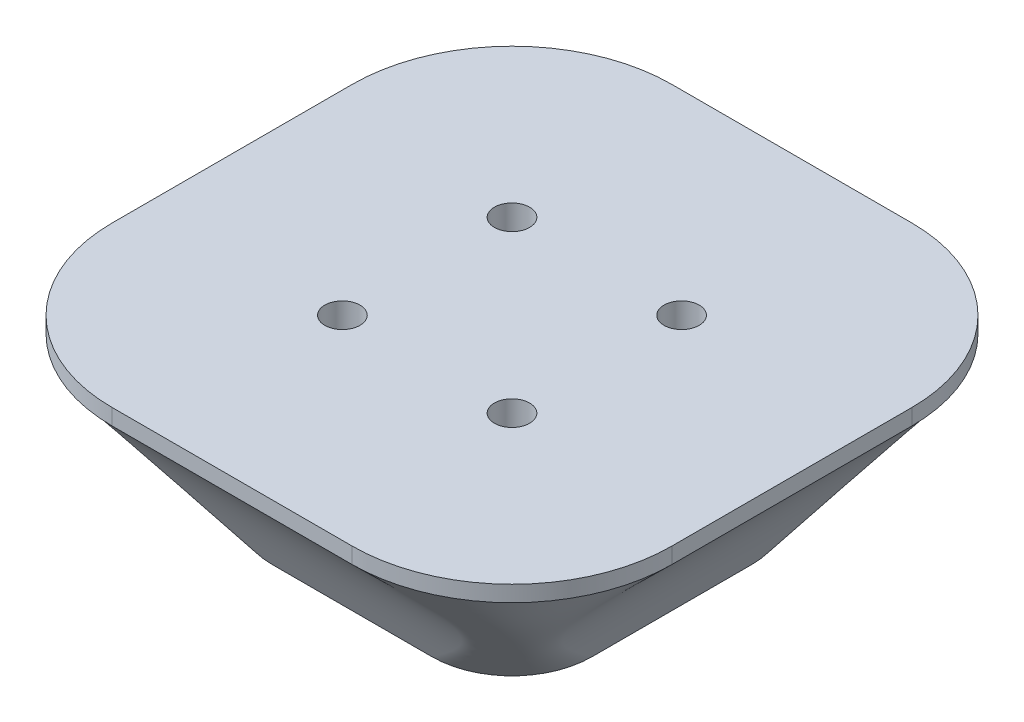
ISO-10303-21;
HEADER;
FILE_DESCRIPTION(('STEP AP214'),'2;1');
FILE_NAME('part.step','',(''),(''),'','','');
FILE_SCHEMA(('AUTOMOTIVE_DESIGN { 1 0 10303 214 1 1 1 1 }'));
ENDSEC;
DATA;
#1=APPLICATION_CONTEXT('core data for automotive mechanical design processes');
#2=APPLICATION_PROTOCOL_DEFINITION('international standard','automotive_design',2000,#1);
#3=PRODUCT_CONTEXT('',#1,'mechanical');
#4=PRODUCT('Part','Part','',(#3));
#5=PRODUCT_RELATED_PRODUCT_CATEGORY('part','',(#4));
#6=PRODUCT_DEFINITION_FORMATION('','',#4);
#7=PRODUCT_DEFINITION_CONTEXT('part definition',#1,'design');
#8=PRODUCT_DEFINITION('design','',#6,#7);
#9=PRODUCT_DEFINITION_SHAPE('','',#8);
#10=(LENGTH_UNIT() NAMED_UNIT(*) SI_UNIT(.MILLI.,.METRE.));
#11=(NAMED_UNIT(*) PLANE_ANGLE_UNIT() SI_UNIT($,.RADIAN.));
#12=(NAMED_UNIT(*) SI_UNIT($,.STERADIAN.) SOLID_ANGLE_UNIT());
#13=UNCERTAINTY_MEASURE_WITH_UNIT(LENGTH_MEASURE(1.E-05),#10,'distance_accuracy_value','');
#14=(GEOMETRIC_REPRESENTATION_CONTEXT(3) GLOBAL_UNCERTAINTY_ASSIGNED_CONTEXT((#13)) GLOBAL_UNIT_ASSIGNED_CONTEXT((#10,
#11,#12)) REPRESENTATION_CONTEXT('',''));
#15=CARTESIAN_POINT('',(0.,0.,0.));
#16=DIRECTION('',(0.,0.,1.));
#17=DIRECTION('',(1.,0.,0.));
#18=AXIS2_PLACEMENT_3D('',#15,#16,#17);
#19=CARTESIAN_POINT('',(-10.,0.,10.));
#20=DIRECTION('',(0.,-1.,0.));
#21=DIRECTION('',(0.,0.,-1.));
#22=AXIS2_PLACEMENT_3D('',#19,#20,#21);
#23=PLANE('',#22);
#24=CARTESIAN_POINT('',(-10.6066017177982,0.,10.6066017177982));
#25=DIRECTION('',(0.,-1.,0.));
#26=DIRECTION('',(0.,0.,-1.));
#27=AXIS2_PLACEMENT_3D('',#24,#25,#26);
#28=CIRCLE('',#27,2.2);
#29=CARTESIAN_POINT('',(-10.6066017177982,0.,8.40660171779821));
#30=VERTEX_POINT('',#29);
#31=EDGE_CURVE('E468',#30,#30,#28,.T.);
#32=ORIENTED_EDGE('',*,*,#31,.F.);
#33=EDGE_LOOP('',(#32));
#34=FACE_BOUND('',#33,.T.);
#35=CARTESIAN_POINT('',(10.6066017177982,0.,10.6066017177982));
#36=DIRECTION('',(0.,-1.,0.));
#37=DIRECTION('',(0.,0.,-1.));
#38=AXIS2_PLACEMENT_3D('',#35,#36,#37);
#39=CIRCLE('',#38,2.2);
#40=CARTESIAN_POINT('',(10.6066017177982,0.,8.40660171779821));
#41=VERTEX_POINT('',#40);
#42=EDGE_CURVE('E465',#41,#41,#39,.T.);
#43=ORIENTED_EDGE('',*,*,#42,.F.);
#44=EDGE_LOOP('',(#43));
#45=FACE_BOUND('',#44,.T.);
#46=CARTESIAN_POINT('',(10.6066017177982,0.,-10.6066017177982));
#47=DIRECTION('',(0.,-1.,0.));
#48=DIRECTION('',(0.,0.,-1.));
#49=AXIS2_PLACEMENT_3D('',#46,#47,#48);
#50=CIRCLE('',#49,2.2);
#51=CARTESIAN_POINT('',(10.6066017177982,0.,-12.8066017177982));
#52=VERTEX_POINT('',#51);
#53=EDGE_CURVE('E405',#52,#52,#50,.T.);
#54=ORIENTED_EDGE('',*,*,#53,.F.);
#55=EDGE_LOOP('',(#54));
#56=FACE_BOUND('',#55,.T.);
#57=CARTESIAN_POINT('',(-10.6066017177982,0.,-10.6066017177982));
#58=DIRECTION('',(0.,-1.,0.));
#59=DIRECTION('',(0.,0.,-1.));
#60=AXIS2_PLACEMENT_3D('',#57,#58,#59);
#61=CIRCLE('',#60,2.2);
#62=CARTESIAN_POINT('',(-10.6066017177982,0.,-12.8066017177982));
#63=VERTEX_POINT('',#62);
#64=EDGE_CURVE('E402',#63,#63,#61,.T.);
#65=ORIENTED_EDGE('',*,*,#64,.F.);
#66=EDGE_LOOP('',(#65));
#67=FACE_BOUND('',#66,.T.);
#68=CARTESIAN_POINT('',(-10.,0.,10.));
#69=DIRECTION('',(0.,-1.,0.));
#70=DIRECTION('',(0.,0.,-1.));
#71=AXIS2_PLACEMENT_3D('',#68,#69,#70);
#72=CIRCLE('',#71,10.);
#73=CARTESIAN_POINT('',(-9.99999999999993,0.,20.));
#74=VERTEX_POINT('',#73);
#75=CARTESIAN_POINT('',(-20.,0.,9.99999999982747));
#76=VERTEX_POINT('',#75);
#77=EDGE_CURVE('E471',#74,#76,#72,.T.);
#78=ORIENTED_EDGE('',*,*,#77,.T.);
#79=DIRECTION('',(0.,0.,-1.));
#80=VECTOR('',#79,1.);
#81=CARTESIAN_POINT('',(-20.,0.,9.99999999999993));
#82=LINE('',#81,#80);
#83=CARTESIAN_POINT('',(-20.,0.,-9.99999999962519));
#84=VERTEX_POINT('',#83);
#85=EDGE_CURVE('E307',#76,#84,#82,.T.);
#86=ORIENTED_EDGE('',*,*,#85,.T.);
#87=CARTESIAN_POINT('',(-10.,0.,-10.));
#88=DIRECTION('',(0.,-1.,0.));
#89=DIRECTION('',(0.,0.,-1.));
#90=AXIS2_PLACEMENT_3D('',#87,#88,#89);
#91=CIRCLE('',#90,10.);
#92=CARTESIAN_POINT('',(-9.99999999982747,0.,-20.));
#93=VERTEX_POINT('',#92);
#94=EDGE_CURVE('E571',#84,#93,#91,.T.);
#95=ORIENTED_EDGE('',*,*,#94,.T.);
#96=DIRECTION('',(1.,0.,0.));
#97=VECTOR('',#96,1.);
#98=CARTESIAN_POINT('',(-9.99999999999993,0.,-20.));
#99=LINE('',#98,#97);
#100=CARTESIAN_POINT('',(9.9999999996252,0.,-20.));
#101=VERTEX_POINT('',#100);
#102=EDGE_CURVE('E560',#93,#101,#99,.T.);
#103=ORIENTED_EDGE('',*,*,#102,.T.);
#104=CARTESIAN_POINT('',(10.,0.,-10.));
#105=DIRECTION('',(0.,1.,0.));
#106=DIRECTION('',(0.,0.,1.));
#107=AXIS2_PLACEMENT_3D('',#104,#105,#106);
#108=CIRCLE('',#107,10.);
#109=CARTESIAN_POINT('',(20.,0.,-9.99999999982735));
#110=VERTEX_POINT('',#109);
#111=EDGE_CURVE('E549',#110,#101,#108,.T.);
#112=ORIENTED_EDGE('',*,*,#111,.F.);
#113=DIRECTION('',(0.,0.,-1.));
#114=VECTOR('',#113,1.);
#115=CARTESIAN_POINT('',(20.,0.,9.99999999999993));
#116=LINE('',#115,#114);
#117=CARTESIAN_POINT('',(20.,0.,9.99999999970828));
#118=VERTEX_POINT('',#117);
#119=EDGE_CURVE('E538',#118,#110,#116,.T.);
#120=ORIENTED_EDGE('',*,*,#119,.F.);
#121=CARTESIAN_POINT('',(10.,0.,10.));
#122=DIRECTION('',(0.,1.,0.));
#123=DIRECTION('',(0.,0.,1.));
#124=AXIS2_PLACEMENT_3D('',#121,#122,#123);
#125=CIRCLE('',#124,10.);
#126=CARTESIAN_POINT('',(9.99999999999993,0.,20.));
#127=VERTEX_POINT('',#126);
#128=EDGE_CURVE('E527',#127,#118,#125,.T.);
#129=ORIENTED_EDGE('',*,*,#128,.F.);
#130=DIRECTION('',(1.,0.,0.));
#131=VECTOR('',#130,1.);
#132=CARTESIAN_POINT('',(-9.99999999999993,0.,20.));
#133=LINE('',#132,#131);
#134=EDGE_CURVE('E516',#74,#127,#133,.T.);
#135=ORIENTED_EDGE('',*,*,#134,.F.);
#136=EDGE_LOOP('',(#78,#86,#95,#103,#112,#120,#129,#135));
#137=FACE_BOUND('',#136,.T.);
#138=ADVANCED_FACE('F279',(#34,#45,#56,#67,#137),#23,.T.);
#139=CARTESIAN_POINT('',(9.99999999830563,0.,20.));
#140=CARTESIAN_POINT('',(16.1431482179764,5.21406175823628,22.942619762586));
#141=CARTESIAN_POINT('',(24.6079283399804,12.3986330477086,26.9973207696682));
#142=CARTESIAN_POINT('',(17.0679789418793,18.3639067395197,33.2775296026744));
#143=CARTESIAN_POINT('',(14.9999999970859,20.,35.));
#144=CARTESIAN_POINT('',(10.3058481270578,0.,20.));
#145=CARTESIAN_POINT('',(16.5111708958495,5.21406175823628,22.942619762586));
#146=CARTESIAN_POINT('',(25.0616227074619,12.3986330477086,26.9973207696682));
#147=CARTESIAN_POINT('',(17.5784503451764,18.3639067395197,33.2775296026744));
#148=CARTESIAN_POINT('',(15.5260436155817,20.,35.));
#149=CARTESIAN_POINT('',(10.925113102341,0.,19.9712504429643));
#150=CARTESIAN_POINT('',(17.1540095165254,5.21406175823627,22.8898791353974));
#151=CARTESIAN_POINT('',(25.7369439767388,12.3986330477086,26.9115223150476));
#152=CARTESIAN_POINT('',(18.5742471105834,18.3639067395198,33.2267115306444));
#153=CARTESIAN_POINT('',(16.6097370687949,20.,34.9587759836936));
#154=CARTESIAN_POINT('',(11.865329232195,0.,19.8389278624877));
#155=CARTESIAN_POINT('',(17.9597904094337,5.21406175823627,22.722646264018));
#156=CARTESIAN_POINT('',(26.3574835763062,12.3986330477086,26.6961857798917));
#157=CARTESIAN_POINT('',(20.05205466711,18.3639067395198,33.0154090244489));
#158=CARTESIAN_POINT('',(18.3226671694441,20.,34.7485798890286));
#159=CARTESIAN_POINT('',(12.8054765324051,0.,19.6144574632727));
#160=CARTESIAN_POINT('',(18.6454386943739,5.21406175823627,22.4956911128144));
#161=CARTESIAN_POINT('',(26.692452026007,12.3986330477086,26.4658068338374));
#162=CARTESIAN_POINT('',(21.5311474218129,18.3639067395197,32.665067050574));
#163=CARTESIAN_POINT('',(20.1155584456022,20.,34.3653357028723));
#164=CARTESIAN_POINT('',(14.0437311643957,0.,19.1883670742473));
#165=CARTESIAN_POINT('',(19.4333927586978,5.21406175823629,22.1386816547575));
#166=CARTESIAN_POINT('',(26.8599269552342,12.3986330477087,26.2039855220471));
#167=CARTESIAN_POINT('',(23.501266700484,18.3639067395197,32.000205315424));
#168=CARTESIAN_POINT('',(22.5800882783467,20.,33.5899322299198));
#169=CARTESIAN_POINT('',(15.5344398974085,0.,18.4106366720413));
#170=CARTESIAN_POINT('',(20.2205987417209,5.21406175823627,21.6246446707612));
#171=CARTESIAN_POINT('',(26.6777609027888,12.3986330477086,26.053297544936));
#172=CARTESIAN_POINT('',(25.9405677872702,18.3639067395198,30.7685151528263));
#173=CARTESIAN_POINT('',(25.7383781225062,20.,32.0617560246672));
#174=CARTESIAN_POINT('',(17.1204576713674,0.,17.1204576713674));
#175=CARTESIAN_POINT('',(20.9652110269836,5.21406175823629,20.9652110269836));
#176=CARTESIAN_POINT('',(26.2629819116934,12.3986330477087,26.2629819116934));
#177=CARTESIAN_POINT('',(28.6179123324305,18.3639067395197,28.6179123324305));
#178=CARTESIAN_POINT('',(29.2637981692459,20.,29.2637981692459));
#179=CARTESIAN_POINT('',(18.4106366720412,0.,15.5344398974084));
#180=CARTESIAN_POINT('',(21.6246446707612,5.21406175823628,20.2205987417209));
#181=CARTESIAN_POINT('',(26.0532975449361,12.3986330477086,26.6777609027887));
#182=CARTESIAN_POINT('',(30.7685151528262,18.3639067395197,25.9405677872702));
#183=CARTESIAN_POINT('',(32.0617560246671,20.,25.7383781225063));
#184=CARTESIAN_POINT('',(19.1883670742473,0.,14.0437311643958));
#185=CARTESIAN_POINT('',(22.1386816547575,5.21406175823627,19.4333927586978));
#186=CARTESIAN_POINT('',(26.2039855220471,12.3986330477086,26.8599269552342));
#187=CARTESIAN_POINT('',(32.000205315424,18.3639067395197,23.501266700484));
#188=CARTESIAN_POINT('',(33.5899322299199,20.,22.5800882783467));
#189=CARTESIAN_POINT('',(19.6144574632728,0.,12.8054765324051));
#190=CARTESIAN_POINT('',(22.4956911128144,5.21406175823629,18.6454386943739));
#191=CARTESIAN_POINT('',(26.4658068338375,12.3986330477087,26.692452026007));
#192=CARTESIAN_POINT('',(32.665067050574,18.3639067395198,21.5311474218129));
#193=CARTESIAN_POINT('',(34.3653357028723,20.,20.1155584456022));
#194=CARTESIAN_POINT('',(19.8389278624877,0.,11.865329232195));
#195=CARTESIAN_POINT('',(22.722646264018,5.21406175823625,17.9597904094336));
#196=CARTESIAN_POINT('',(26.6961857798917,12.3986330477086,26.3574835763062));
#197=CARTESIAN_POINT('',(33.0154090244489,18.3639067395197,20.05205466711));
#198=CARTESIAN_POINT('',(34.7485798890285,20.,18.3226671694441));
#199=CARTESIAN_POINT('',(19.9712504429643,0.,10.925113102341));
#200=CARTESIAN_POINT('',(22.8898791353974,5.2140617582363,17.1540095165254));
#201=CARTESIAN_POINT('',(26.9115223150476,12.3986330477087,25.7369439767388));
#202=CARTESIAN_POINT('',(33.2267115306444,18.3639067395198,18.5742471105834));
#203=CARTESIAN_POINT('',(34.9587759836935,20.,16.6097370687949));
#204=CARTESIAN_POINT('',(20.,0.,10.3058481270578));
#205=CARTESIAN_POINT('',(22.942619762586,5.21406175823628,16.5111708958495));
#206=CARTESIAN_POINT('',(26.9973207696682,12.3986330477086,25.0616227074618));
#207=CARTESIAN_POINT('',(33.2775296026744,18.3639067395197,17.5784503451764));
#208=CARTESIAN_POINT('',(35.,20.,15.5260436155817));
#209=CARTESIAN_POINT('',(20.,0.,8.24772891052919));
#210=CARTESIAN_POINT('',(22.942619762586,5.21406175823628,14.0346654859938));
#211=CARTESIAN_POINT('',(26.9973207696682,12.3986330477086,22.0086136864356));
#212=CARTESIAN_POINT('',(33.2775296026744,18.3639067395197,14.1433761830411));
#213=CARTESIAN_POINT('',(35.,20.,11.9861805980262));
#214=CARTESIAN_POINT('',(20.,0.,4.88085826567106));
#215=CARTESIAN_POINT('',(22.942619762586,5.21406175823629,9.11621031612582));
#216=CARTESIAN_POINT('',(26.9973207696682,12.3986330477087,14.9521958018056));
#217=CARTESIAN_POINT('',(33.2775296026744,18.3639067395197,8.65070804335033));
#218=CARTESIAN_POINT('',(35.,20.,6.92240148354227));
#219=CARTESIAN_POINT('',(20.,0.,0.));
#220=CARTESIAN_POINT('',(22.942619762586,5.21406175823628,0.));
#221=CARTESIAN_POINT('',(26.9973207696682,12.3986330477086,0.));
#222=CARTESIAN_POINT('',(33.2775296026744,18.3639067395197,0.));
#223=CARTESIAN_POINT('',(35.,20.,0.));
#224=CARTESIAN_POINT('',(20.,0.,-4.88085826567107));
#225=CARTESIAN_POINT('',(22.942619762586,5.21406175823627,-9.11621031612582));
#226=CARTESIAN_POINT('',(26.9973207696682,12.3986330477086,-14.9521958018056));
#227=CARTESIAN_POINT('',(33.2775296026744,18.3639067395197,-8.65070804335032));
#228=CARTESIAN_POINT('',(35.,20.,-6.92240148354226));
#229=CARTESIAN_POINT('',(20.,0.,-8.24772891052919));
#230=CARTESIAN_POINT('',(22.942619762586,5.21406175823628,-14.0346654859938));
#231=CARTESIAN_POINT('',(26.9973207696682,12.3986330477086,-22.0086136864356));
#232=CARTESIAN_POINT('',(33.2775296026744,18.3639067395197,-14.1433761830411));
#233=CARTESIAN_POINT('',(35.,20.,-11.9861805980262));
#234=CARTESIAN_POINT('',(20.,0.,-10.3058481270578));
#235=CARTESIAN_POINT('',(22.942619762586,5.21406175823628,-16.5111708958495));
#236=CARTESIAN_POINT('',(26.9973207696682,12.3986330477086,-25.0616227074619));
#237=CARTESIAN_POINT('',(33.2775296026744,18.3639067395197,-17.5784503451764));
#238=CARTESIAN_POINT('',(35.,20.,-15.5260436155816));
#239=CARTESIAN_POINT('',(19.9712504429642,0.,-10.925113102341));
#240=CARTESIAN_POINT('',(22.8898791353975,5.21406175823626,-17.1540095165254));
#241=CARTESIAN_POINT('',(26.9115223150476,12.3986330477086,-25.7369439767387));
#242=CARTESIAN_POINT('',(33.2267115306444,18.3639067395197,-18.5742471105834));
#243=CARTESIAN_POINT('',(34.9587759836936,20.,-16.6097370687949));
#244=CARTESIAN_POINT('',(19.8389278624877,0.,-11.865329232195));
#245=CARTESIAN_POINT('',(22.722646264018,5.21406175823628,-17.9597904094336));
#246=CARTESIAN_POINT('',(26.6961857798917,12.3986330477086,-26.3574835763062));
#247=CARTESIAN_POINT('',(33.0154090244489,18.3639067395198,-20.05205466711));
#248=CARTESIAN_POINT('',(34.7485798890286,20.,-18.3226671694441));
#249=CARTESIAN_POINT('',(19.6144574632727,0.,-12.8054765324051));
#250=CARTESIAN_POINT('',(22.4956911128144,5.21406175823627,-18.6454386943738));
#251=CARTESIAN_POINT('',(26.4658068338375,12.3986330477086,-26.6924520260069));
#252=CARTESIAN_POINT('',(32.665067050574,18.3639067395197,-21.5311474218129));
#253=CARTESIAN_POINT('',(34.3653357028723,20.,-20.1155584456022));
#254=CARTESIAN_POINT('',(19.1883670742473,0.,-14.0437311643957));
#255=CARTESIAN_POINT('',(22.1386816547574,5.21406175823629,-19.4333927586979));
#256=CARTESIAN_POINT('',(26.2039855220471,12.3986330477087,-26.8599269552343));
#257=CARTESIAN_POINT('',(32.000205315424,18.3639067395197,-23.501266700484));
#258=CARTESIAN_POINT('',(33.5899322299198,20.,-22.5800882783467));
#259=CARTESIAN_POINT('',(18.4106366720413,0.,-15.5344398974085));
#260=CARTESIAN_POINT('',(21.6246446707612,5.21406175823627,-20.2205987417209));
#261=CARTESIAN_POINT('',(26.053297544936,12.3986330477086,-26.6777609027887));
#262=CARTESIAN_POINT('',(30.7685151528264,18.3639067395198,-25.9405677872702));
#263=CARTESIAN_POINT('',(32.0617560246672,20.,-25.7383781225062));
#264=CARTESIAN_POINT('',(17.1204576713674,0.,-17.1204576713674));
#265=CARTESIAN_POINT('',(20.9652110269836,5.21406175823629,-20.9652110269836));
#266=CARTESIAN_POINT('',(26.2629819116934,12.3986330477087,-26.2629819116935));
#267=CARTESIAN_POINT('',(28.6179123324304,18.3639067395197,-28.6179123324305));
#268=CARTESIAN_POINT('',(29.2637981692458,20.,-29.2637981692459));
#269=CARTESIAN_POINT('',(15.5344398974085,0.,-18.4106366720413));
#270=CARTESIAN_POINT('',(20.220598741721,5.21406175823629,-21.6246446707612));
#271=CARTESIAN_POINT('',(26.6777609027889,12.3986330477087,-26.053297544936));
#272=CARTESIAN_POINT('',(25.9405677872702,18.3639067395198,-30.7685151528263));
#273=CARTESIAN_POINT('',(25.7383781225063,20.,-32.0617560246671));
#274=CARTESIAN_POINT('',(14.0437311643958,0.,-19.1883670742473));
#275=CARTESIAN_POINT('',(19.4333927586978,5.21406175823627,-22.1386816547575));
#276=CARTESIAN_POINT('',(26.8599269552341,12.3986330477086,-26.2039855220472));
#277=CARTESIAN_POINT('',(23.501266700484,18.3639067395197,-32.000205315424));
#278=CARTESIAN_POINT('',(22.5800882783467,20.,-33.5899322299199));
#279=CARTESIAN_POINT('',(12.8054765324051,0.,-19.6144574632727));
#280=CARTESIAN_POINT('',(18.6454386943739,5.21406175823629,-22.4956911128144));
#281=CARTESIAN_POINT('',(26.692452026007,12.3986330477087,-26.4658068338374));
#282=CARTESIAN_POINT('',(21.5311474218129,18.3639067395197,-32.665067050574));
#283=CARTESIAN_POINT('',(20.1155584456022,20.,-34.3653357028723));
#284=CARTESIAN_POINT('',(11.865329232195,0.,-19.8389278624877));
#285=CARTESIAN_POINT('',(17.9597904094336,5.21406175823627,-22.7226462640181));
#286=CARTESIAN_POINT('',(26.3574835763061,12.3986330477086,-26.6961857798919));
#287=CARTESIAN_POINT('',(20.05205466711,18.3639067395197,-33.0154090244489));
#288=CARTESIAN_POINT('',(18.3226671694441,20.,-34.7485798890285));
#289=CARTESIAN_POINT('',(10.925113102341,0.,-19.9712504429643));
#290=CARTESIAN_POINT('',(17.1540095165254,5.21406175823628,-22.8898791353974));
#291=CARTESIAN_POINT('',(25.7369439767388,12.3986330477086,-26.9115223150475));
#292=CARTESIAN_POINT('',(18.5742471105834,18.3639067395197,-33.2267115306443));
#293=CARTESIAN_POINT('',(16.6097370687949,20.,-34.9587759836935));
#294=CARTESIAN_POINT('',(10.3058481270578,0.,-20.));
#295=CARTESIAN_POINT('',(16.5111708958495,5.21406175823628,-22.942619762586));
#296=CARTESIAN_POINT('',(25.0616227074619,12.3986330477086,-26.9973207696682));
#297=CARTESIAN_POINT('',(17.5784503451764,18.3639067395197,-33.2775296026744));
#298=CARTESIAN_POINT('',(15.5260436155817,20.,-35.));
#299=CARTESIAN_POINT('',(8.24772891052919,0.,-20.));
#300=CARTESIAN_POINT('',(14.0346654859938,5.21406175823628,-22.942619762586));
#301=CARTESIAN_POINT('',(22.0086136864356,12.3986330477086,-26.9973207696682));
#302=CARTESIAN_POINT('',(14.1433761830411,18.3639067395197,-33.2775296026744));
#303=CARTESIAN_POINT('',(11.9861805980262,20.,-35.));
#304=CARTESIAN_POINT('',(4.88085826567106,0.,-20.));
#305=CARTESIAN_POINT('',(9.11621031612582,5.21406175823627,-22.942619762586));
#306=CARTESIAN_POINT('',(14.9521958018056,12.3986330477086,-26.9973207696682));
#307=CARTESIAN_POINT('',(8.65070804335032,18.3639067395197,-33.2775296026743));
#308=CARTESIAN_POINT('',(6.92240148354225,20.,-35.));
#309=CARTESIAN_POINT('',(0.,0.,-20.));
#310=CARTESIAN_POINT('',(0.,5.21406175823629,-22.942619762586));
#311=CARTESIAN_POINT('',(0.,12.3986330477087,-26.9973207696682));
#312=CARTESIAN_POINT('',(0.,18.3639067395197,-33.2775296026744));
#313=CARTESIAN_POINT('',(0.,20.,-35.));
#314=CARTESIAN_POINT('',(-4.88085826567107,0.,-20.));
#315=CARTESIAN_POINT('',(-9.11621031612582,5.21406175823628,-22.942619762586));
#316=CARTESIAN_POINT('',(-14.9521958018056,12.3986330477086,-26.9973207696682));
#317=CARTESIAN_POINT('',(-8.65070804335032,18.3639067395198,-33.2775296026744));
#318=CARTESIAN_POINT('',(-6.92240148354226,20.,-35.));
#319=CARTESIAN_POINT('',(-8.24772891052919,0.,-20.));
#320=CARTESIAN_POINT('',(-14.0346654859938,5.21406175823628,-22.942619762586));
#321=CARTESIAN_POINT('',(-22.0086136864356,12.3986330477086,-26.9973207696682));
#322=CARTESIAN_POINT('',(-14.1433761830411,18.3639067395197,-33.2775296026744));
#323=CARTESIAN_POINT('',(-11.9861805980262,20.,-35.));
#324=CARTESIAN_POINT('',(-10.3058481270579,0.,-20.));
#325=CARTESIAN_POINT('',(-16.5111708958495,5.21406175823628,-22.942619762586));
#326=CARTESIAN_POINT('',(-25.0616227074618,12.3986330477086,-26.9973207696682));
#327=CARTESIAN_POINT('',(-17.5784503451764,18.3639067395197,-33.2775296026744));
#328=CARTESIAN_POINT('',(-15.5260436155817,20.,-35.));
#329=CARTESIAN_POINT('',(-10.9251131023411,0.,-19.9712504429642));
#330=CARTESIAN_POINT('',(-17.1540095165255,5.21406175823627,-22.8898791353974));
#331=CARTESIAN_POINT('',(-25.7369439767387,12.3986330477086,-26.9115223150476));
#332=CARTESIAN_POINT('',(-18.5742471105834,18.3639067395197,-33.2267115306443));
#333=CARTESIAN_POINT('',(-16.6097370687949,20.,-34.9587759836935));
#334=CARTESIAN_POINT('',(-11.8653292321951,0.,-19.8389278624877));
#335=CARTESIAN_POINT('',(-17.9597904094337,5.21406175823628,-22.7226462640181));
#336=CARTESIAN_POINT('',(-26.3574835763062,12.3986330477086,-26.6961857798918));
#337=CARTESIAN_POINT('',(-20.05205466711,18.3639067395197,-33.0154090244489));
#338=CARTESIAN_POINT('',(-18.3226671694441,20.,-34.7485798890285));
#339=CARTESIAN_POINT('',(-12.8054765324052,0.,-19.6144574632727));
#340=CARTESIAN_POINT('',(-18.6454386943739,5.21406175823627,-22.4956911128144));
#341=CARTESIAN_POINT('',(-26.6924520260069,12.3986330477086,-26.4658068338374));
#342=CARTESIAN_POINT('',(-21.531147421813,18.3639067395197,-32.665067050574));
#343=CARTESIAN_POINT('',(-20.1155584456023,20.,-34.3653357028723));
#344=CARTESIAN_POINT('',(-14.0437311643958,0.,-19.1883670742473));
#345=CARTESIAN_POINT('',(-19.4333927586979,5.21406175823627,-22.1386816547574));
#346=CARTESIAN_POINT('',(-26.8599269552343,12.3986330477086,-26.2039855220471));
#347=CARTESIAN_POINT('',(-23.501266700484,18.3639067395197,-32.000205315424));
#348=CARTESIAN_POINT('',(-22.5800882783467,20.,-33.5899322299199));
#349=CARTESIAN_POINT('',(-15.5344398974085,0.,-18.4106366720412));
#350=CARTESIAN_POINT('',(-20.2205987417209,5.2140617582363,-21.6246446707612));
#351=CARTESIAN_POINT('',(-26.6777609027887,12.3986330477087,-26.0532975449361));
#352=CARTESIAN_POINT('',(-25.9405677872701,18.3639067395197,-30.7685151528263));
#353=CARTESIAN_POINT('',(-25.7383781225062,20.,-32.0617560246671));
#354=CARTESIAN_POINT('',(-17.1204576713674,0.,-17.1204576713674));
#355=CARTESIAN_POINT('',(-20.9652110269836,5.21406175823627,-20.9652110269836));
#356=CARTESIAN_POINT('',(-26.2629819116934,12.3986330477086,-26.2629819116933));
#357=CARTESIAN_POINT('',(-28.6179123324306,18.3639067395198,-28.6179123324305));
#358=CARTESIAN_POINT('',(-29.263798169246,20.0000000000001,-29.2637981692459));
#359=CARTESIAN_POINT('',(-18.4106366720412,0.,-15.5344398974084));
#360=CARTESIAN_POINT('',(-21.6246446707612,5.21406175823629,-20.2205987417209));
#361=CARTESIAN_POINT('',(-26.053297544936,12.3986330477087,-26.6777609027888));
#362=CARTESIAN_POINT('',(-30.7685151528262,18.3639067395197,-25.9405677872702));
#363=CARTESIAN_POINT('',(-32.061756024667,19.9999999999999,-25.7383781225062));
#364=CARTESIAN_POINT('',(-19.1883670742473,0.,-14.0437311643957));
#365=CARTESIAN_POINT('',(-22.1386816547575,5.21406175823627,-19.4333927586978));
#366=CARTESIAN_POINT('',(-26.2039855220472,12.3986330477086,-26.8599269552342));
#367=CARTESIAN_POINT('',(-32.0002053154241,18.3639067395198,-23.501266700484));
#368=CARTESIAN_POINT('',(-33.58993222992,20.,-22.5800882783467));
#369=CARTESIAN_POINT('',(-19.6144574632728,0.,-12.8054765324051));
#370=CARTESIAN_POINT('',(-22.4956911128144,5.21406175823628,-18.6454386943739));
#371=CARTESIAN_POINT('',(-26.4658068338373,12.3986330477086,-26.692452026007));
#372=CARTESIAN_POINT('',(-32.665067050574,18.3639067395198,-21.5311474218129));
#373=CARTESIAN_POINT('',(-34.3653357028723,20.,-20.1155584456022));
#374=CARTESIAN_POINT('',(-19.8389278624877,0.,-11.865329232195));
#375=CARTESIAN_POINT('',(-22.7226462640181,5.21406175823629,-17.9597904094336));
#376=CARTESIAN_POINT('',(-26.6961857798919,12.3986330477087,-26.3574835763062));
#377=CARTESIAN_POINT('',(-33.0154090244489,18.3639067395197,-20.05205466711));
#378=CARTESIAN_POINT('',(-34.7485798890285,20.,-18.3226671694441));
#379=CARTESIAN_POINT('',(-19.9712504429643,0.,-10.925113102341));
#380=CARTESIAN_POINT('',(-22.8898791353974,5.21406175823628,-17.1540095165254));
#381=CARTESIAN_POINT('',(-26.9115223150475,12.3986330477087,-25.7369439767387));
#382=CARTESIAN_POINT('',(-33.2267115306443,18.3639067395197,-18.5742471105834));
#383=CARTESIAN_POINT('',(-34.9587759836935,20.,-16.6097370687949));
#384=CARTESIAN_POINT('',(-20.,0.,-10.3058481270578));
#385=CARTESIAN_POINT('',(-22.942619762586,5.21406175823628,-16.5111708958495));
#386=CARTESIAN_POINT('',(-26.9973207696682,12.3986330477086,-25.0616227074618));
#387=CARTESIAN_POINT('',(-33.2775296026744,18.3639067395197,-17.5784503451764));
#388=CARTESIAN_POINT('',(-35.,20.,-15.5260436155816));
#389=CARTESIAN_POINT('',(-20.,0.,-8.24772891052919));
#390=CARTESIAN_POINT('',(-22.942619762586,5.21406175823628,-14.0346654859938));
#391=CARTESIAN_POINT('',(-26.9973207696682,12.3986330477086,-22.0086136864356));
#392=CARTESIAN_POINT('',(-33.2775296026744,18.3639067395197,-14.1433761830411));
#393=CARTESIAN_POINT('',(-35.,20.,-11.9861805980262));
#394=CARTESIAN_POINT('',(-20.,0.,-4.88085826567106));
#395=CARTESIAN_POINT('',(-22.942619762586,5.21406175823627,-9.11621031612581));
#396=CARTESIAN_POINT('',(-26.9973207696682,12.3986330477086,-14.9521958018056));
#397=CARTESIAN_POINT('',(-33.2775296026744,18.3639067395198,-8.65070804335031));
#398=CARTESIAN_POINT('',(-35.,20.,-6.92240148354225));
#399=CARTESIAN_POINT('',(-20.,0.,0.));
#400=CARTESIAN_POINT('',(-22.942619762586,5.2140617582363,0.));
#401=CARTESIAN_POINT('',(-26.9973207696682,12.3986330477087,0.));
#402=CARTESIAN_POINT('',(-33.2775296026744,18.3639067395197,0.));
#403=CARTESIAN_POINT('',(-35.,20.,0.));
#404=CARTESIAN_POINT('',(-20.,0.,4.88085826567107));
#405=CARTESIAN_POINT('',(-22.942619762586,5.21406175823627,9.11621031612584));
#406=CARTESIAN_POINT('',(-26.9973207696682,12.3986330477086,14.9521958018057));
#407=CARTESIAN_POINT('',(-33.2775296026744,18.3639067395198,8.65070804335036));
#408=CARTESIAN_POINT('',(-35.,20.,6.92240148354229));
#409=CARTESIAN_POINT('',(-20.,0.,8.24772891052919));
#410=CARTESIAN_POINT('',(-22.942619762586,5.21406175823628,14.0346654859938));
#411=CARTESIAN_POINT('',(-26.9973207696682,12.3986330477086,22.0086136864356));
#412=CARTESIAN_POINT('',(-33.2775296026744,18.3639067395197,14.1433761830411));
#413=CARTESIAN_POINT('',(-35.,20.,11.9861805980262));
#414=CARTESIAN_POINT('',(-20.,0.,10.3058481270578));
#415=CARTESIAN_POINT('',(-22.942619762586,5.21406175823628,16.5111708958495));
#416=CARTESIAN_POINT('',(-26.9973207696682,12.3986330477086,25.0616227074618));
#417=CARTESIAN_POINT('',(-33.2775296026744,18.3639067395197,17.5784503451764));
#418=CARTESIAN_POINT('',(-35.,20.,15.5260436155817));
#419=CARTESIAN_POINT('',(-19.9712504429642,0.,10.925113102341));
#420=CARTESIAN_POINT('',(-22.8898791353974,5.21406175823629,17.1540095165254));
#421=CARTESIAN_POINT('',(-26.9115223150476,12.3986330477087,25.7369439767388));
#422=CARTESIAN_POINT('',(-33.2267115306444,18.3639067395198,18.5742471105834));
#423=CARTESIAN_POINT('',(-34.9587759836935,20.,16.6097370687949));
#424=CARTESIAN_POINT('',(-19.8389278624877,0.,11.865329232195));
#425=CARTESIAN_POINT('',(-22.722646264018,5.21406175823626,17.9597904094336));
#426=CARTESIAN_POINT('',(-26.6961857798917,12.3986330477086,26.3574835763062));
#427=CARTESIAN_POINT('',(-33.0154090244489,18.3639067395197,20.05205466711));
#428=CARTESIAN_POINT('',(-34.7485798890285,20.,18.3226671694441));
#429=CARTESIAN_POINT('',(-19.6144574632727,0.,12.8054765324051));
#430=CARTESIAN_POINT('',(-22.4956911128144,5.21406175823626,18.6454386943738));
#431=CARTESIAN_POINT('',(-26.4658068338374,12.3986330477086,26.6924520260069));
#432=CARTESIAN_POINT('',(-32.665067050574,18.3639067395197,21.5311474218129));
#433=CARTESIAN_POINT('',(-34.3653357028723,20.,20.1155584456023));
#434=CARTESIAN_POINT('',(-19.1883670742473,0.,14.0437311643957));
#435=CARTESIAN_POINT('',(-22.1386816547575,5.21406175823633,19.4333927586979));
#436=CARTESIAN_POINT('',(-26.2039855220471,12.3986330477088,26.8599269552343));
#437=CARTESIAN_POINT('',(-32.000205315424,18.3639067395198,23.5012667004841));
#438=CARTESIAN_POINT('',(-33.5899322299199,20.,22.5800882783467));
#439=CARTESIAN_POINT('',(-18.4106366720412,0.,15.5344398974085));
#440=CARTESIAN_POINT('',(-21.6246446707612,5.21406175823623,20.2205987417208));
#441=CARTESIAN_POINT('',(-26.053297544936,12.3986330477085,26.6777609027886));
#442=CARTESIAN_POINT('',(-30.7685151528263,18.3639067395197,25.9405677872701));
#443=CARTESIAN_POINT('',(-32.0617560246672,20.,25.7383781225062));
#444=CARTESIAN_POINT('',(-17.1204576713674,0.,17.1204576713674));
#445=CARTESIAN_POINT('',(-20.9652110269836,5.21406175823634,20.9652110269837));
#446=CARTESIAN_POINT('',(-26.2629819116934,12.3986330477088,26.2629819116935));
#447=CARTESIAN_POINT('',(-28.6179123324305,18.3639067395198,28.6179123324306));
#448=CARTESIAN_POINT('',(-29.2637981692459,20.,29.2637981692459));
#449=CARTESIAN_POINT('',(-15.5344398974085,0.,18.4106366720413));
#450=CARTESIAN_POINT('',(-20.2205987417209,5.21406175823623,21.6246446707612));
#451=CARTESIAN_POINT('',(-26.6777609027886,12.3986330477085,26.053297544936));
#452=CARTESIAN_POINT('',(-25.9405677872702,18.3639067395197,30.7685151528262));
#453=CARTESIAN_POINT('',(-25.7383781225062,20.,32.0617560246671));
#454=CARTESIAN_POINT('',(-14.0437311643957,0.,19.1883670742473));
#455=CARTESIAN_POINT('',(-19.4333927586978,5.21406175823632,22.1386816547575));
#456=CARTESIAN_POINT('',(-26.8599269552342,12.3986330477087,26.2039855220472));
#457=CARTESIAN_POINT('',(-23.501266700484,18.3639067395198,32.0002053154241));
#458=CARTESIAN_POINT('',(-22.5800882783467,20.,33.58993222992));
#459=CARTESIAN_POINT('',(-12.8054765324051,0.,19.6144574632727));
#460=CARTESIAN_POINT('',(-18.6454386943738,5.21406175823627,22.4956911128144));
#461=CARTESIAN_POINT('',(-26.6924520260069,12.3986330477086,26.4658068338373));
#462=CARTESIAN_POINT('',(-21.5311474218129,18.3639067395197,32.665067050574));
#463=CARTESIAN_POINT('',(-20.1155584456022,20.,34.3653357028723));
#464=CARTESIAN_POINT('',(-11.865329232195,0.,19.8389278624877));
#465=CARTESIAN_POINT('',(-17.9597904094336,5.21406175823628,22.7226462640181));
#466=CARTESIAN_POINT('',(-26.3574835763062,12.3986330477086,26.6961857798919));
#467=CARTESIAN_POINT('',(-20.05205466711,18.3639067395198,33.0154090244489));
#468=CARTESIAN_POINT('',(-18.3226671694441,20.,34.7485798890285));
#469=CARTESIAN_POINT('',(-10.925113102341,0.,19.9712504429643));
#470=CARTESIAN_POINT('',(-17.1540095165254,5.21406175823627,22.8898791353974));
#471=CARTESIAN_POINT('',(-25.7369439767387,12.3986330477086,26.9115223150476));
#472=CARTESIAN_POINT('',(-18.5742471105834,18.3639067395197,33.2267115306443));
#473=CARTESIAN_POINT('',(-16.6097370687949,20.,34.9587759836935));
#474=CARTESIAN_POINT('',(-10.3058481270578,0.,20.));
#475=CARTESIAN_POINT('',(-16.5111708958495,5.21406175823628,22.942619762586));
#476=CARTESIAN_POINT('',(-25.0616227074618,12.3986330477086,26.9973207696682));
#477=CARTESIAN_POINT('',(-17.5784503451764,18.3639067395197,33.2775296026744));
#478=CARTESIAN_POINT('',(-15.5260436155817,20.,35.));
#479=CARTESIAN_POINT('',(-8.24772891052919,0.,20.));
#480=CARTESIAN_POINT('',(-14.0346654859938,5.21406175823628,22.942619762586));
#481=CARTESIAN_POINT('',(-22.0086136864356,12.3986330477086,26.9973207696682));
#482=CARTESIAN_POINT('',(-14.1433761830411,18.3639067395197,33.2775296026744));
#483=CARTESIAN_POINT('',(-11.9861805980262,20.,35.));
#484=CARTESIAN_POINT('',(-4.88085826567106,0.,20.));
#485=CARTESIAN_POINT('',(-9.11621031612581,5.21406175823627,22.942619762586));
#486=CARTESIAN_POINT('',(-14.9521958018056,12.3986330477086,26.9973207696682));
#487=CARTESIAN_POINT('',(-8.65070804335033,18.3639067395198,33.2775296026744));
#488=CARTESIAN_POINT('',(-6.92240148354227,20.,35.));
#489=CARTESIAN_POINT('',(0.,0.,20.));
#490=CARTESIAN_POINT('',(0.,5.21406175823628,22.942619762586));
#491=CARTESIAN_POINT('',(0.,12.3986330477086,26.9973207696681));
#492=CARTESIAN_POINT('',(0.,18.3639067395197,33.2775296026744));
#493=CARTESIAN_POINT('',(0.,20.,35.));
#494=CARTESIAN_POINT('',(4.88085826567107,0.,20.));
#495=CARTESIAN_POINT('',(9.11621031612582,5.21406175823628,22.942619762586));
#496=CARTESIAN_POINT('',(14.9521958018057,12.3986330477087,26.9973207696682));
#497=CARTESIAN_POINT('',(8.65070804335032,18.3639067395197,33.2775296026744));
#498=CARTESIAN_POINT('',(6.92240148354225,20.,35.));
#499=CARTESIAN_POINT('',(8.24772891052919,0.,20.));
#500=CARTESIAN_POINT('',(14.0346654859938,5.21406175823628,22.942619762586));
#501=CARTESIAN_POINT('',(22.0086136864356,12.3986330477086,26.9973207696682));
#502=CARTESIAN_POINT('',(14.1433761830411,18.3639067395197,33.2775296026744));
#503=CARTESIAN_POINT('',(11.9861805980262,20.,35.));
#504=CARTESIAN_POINT('',(9.99999999830563,0.,20.));
#505=CARTESIAN_POINT('',(16.1431482179764,5.21406175823628,22.942619762586));
#506=CARTESIAN_POINT('',(24.6079283399804,12.3986330477086,26.9973207696682));
#507=CARTESIAN_POINT('',(17.0679789418793,18.3639067395197,33.2775296026744));
#508=CARTESIAN_POINT('',(14.9999999970859,20.,35.));
#509=B_SPLINE_SURFACE_WITH_KNOTS('',3,3,((#139,#140,#141,#142,#143),(#144,#145,#146,#147,#148),
(#149,#150,#151,#152,#153),(#154,#155,#156,#157,#158),(#159,#160,#161,#162,#163),(#164,#165,
#166,#167,#168),(#169,#170,#171,#172,#173),(#174,#175,#176,#177,#178),(#179,#180,#181,#182,
#183),(#184,#185,#186,#187,#188),(#189,#190,#191,#192,#193),(#194,#195,#196,#197,#198),(#199,
#200,#201,#202,#203),(#204,#205,#206,#207,#208),(#209,#210,#211,#212,#213),(#214,#215,#216,#217,
#218),(#219,#220,#221,#222,#223),(#224,#225,#226,#227,#228),(#229,#230,#231,#232,#233),(#234,
#235,#236,#237,#238),(#239,#240,#241,#242,#243),(#244,#245,#246,#247,#248),(#249,#250,#251,#252,
#253),(#254,#255,#256,#257,#258),(#259,#260,#261,#262,#263),(#264,#265,#266,#267,#268),(#269,
#270,#271,#272,#273),(#274,#275,#276,#277,#278),(#279,#280,#281,#282,#283),(#284,#285,#286,#287,
#288),(#289,#290,#291,#292,#293),(#294,#295,#296,#297,#298),(#299,#300,#301,#302,#303),(#304,
#305,#306,#307,#308),(#309,#310,#311,#312,#313),(#314,#315,#316,#317,#318),(#319,#320,#321,#322,
#323),(#324,#325,#326,#327,#328),(#329,#330,#331,#332,#333),(#334,#335,#336,#337,#338),(#339,
#340,#341,#342,#343),(#344,#345,#346,#347,#348),(#349,#350,#351,#352,#353),(#354,#355,#356,#357,
#358),(#359,#360,#361,#362,#363),(#364,#365,#366,#367,#368),(#369,#370,#371,#372,#373),(#374,
#375,#376,#377,#378),(#379,#380,#381,#382,#383),(#384,#385,#386,#387,#388),(#389,#390,#391,#392,
#393),(#394,#395,#396,#397,#398),(#399,#400,#401,#402,#403),(#404,#405,#406,#407,#408),(#409,
#410,#411,#412,#413),(#414,#415,#416,#417,#418),(#419,#420,#421,#422,#423),(#424,#425,#426,#427,
#428),(#429,#430,#431,#432,#433),(#434,#435,#436,#437,#438),(#439,#440,#441,#442,#443),(#444,
#445,#446,#447,#448),(#449,#450,#451,#452,#453),(#454,#455,#456,#457,#458),(#459,#460,#461,#462,
#463),(#464,#465,#466,#467,#468),(#469,#470,#471,#472,#473),(#474,#475,#476,#477,#478),(#479,
#480,#481,#482,#483),(#484,#485,#486,#487,#488),(#489,#490,#491,#492,#493),(#494,#495,#496,#497,
#498),(#499,#500,#501,#502,#503),(#504,#505,#506,#507,#508)),.UNSPECIFIED.,.T.,.F.,.F.,(4,1,1,1,
1,1,1,1,1,1,1,1,2,1,1,1,2,1,1,1,1,1,1,1,1,1,1,1,2,1,1,1,2,1,1,1,1,1,1,1,1,1,1,1,2,1,1,1,2,1,1,1,
1,1,1,1,1,1,1,1,2,1,1,1,4),(4,1,4),(0.,0.00642394793185621,0.0128478958637124,
0.0192718437955686,0.0256957917274248,0.0385436875911372,0.0513915834548496,0.0642394793185621,
0.0770873751822745,0.0835113231141307,0.0899352710459869,0.0963592189778431,0.102783166909699,
0.139587375182274,0.17639158345485,0.213195791727425,0.25,0.256423947931856,0.262847895863712,
0.269271843795569,0.275695791727425,0.288543687591137,0.30139158345485,0.314239479318562,
0.327087375182274,0.333511323114131,0.339935271045987,0.346359218977843,0.352783166909699,
0.389587375182274,0.42639158345485,0.463195791727425,0.5,0.506423947931856,0.512847895863712,
0.519271843795569,0.525695791727425,0.538543687591137,0.55139158345485,0.564239479318562,
0.577087375182274,0.58351132311413,0.589935271045987,0.596359218977843,0.602783166909699,
0.639587375182274,0.67639158345485,0.713195791727425,0.75,0.756423947931856,0.762847895863712,
0.769271843795569,0.775695791727425,0.788543687591137,0.80139158345485,0.814239479318562,
0.827087375182274,0.833511323114131,0.839935271045987,0.846359218977843,0.852783166909699,
0.889587375182274,0.92639158345485,0.963195791727425,1.),(0.,0.72573039478034,1.),.UNSPECIFIED.);
#510=DIRECTION('',(-1.,0.,0.));
#511=VECTOR('',#510,1.);
#512=CARTESIAN_POINT('',(15.,20.,35.));
#513=LINE('',#512,#511);
#514=CARTESIAN_POINT('',(15.,20.,35.));
#515=VERTEX_POINT('',#514);
#516=CARTESIAN_POINT('',(-15.,20.,35.));
#517=VERTEX_POINT('',#516);
#518=EDGE_CURVE('E12',#515,#517,#513,.T.);
#519=CARTESIAN_POINT('',(-15.,20.,15.));
#520=DIRECTION('',(0.,-1.,0.));
#521=DIRECTION('',(0.,0.,-1.));
#522=AXIS2_PLACEMENT_3D('',#519,#520,#521);
#523=CIRCLE('',#522,20.);
#524=CARTESIAN_POINT('',(-35.,20.,15.));
#525=VERTEX_POINT('',#524);
#526=EDGE_CURVE('E286',#517,#525,#523,.T.);
#527=DIRECTION('',(0.,0.,-1.));
#528=VECTOR('',#527,1.);
#529=CARTESIAN_POINT('',(-35.,20.,15.));
#530=LINE('',#529,#528);
#531=CARTESIAN_POINT('',(-35.,20.,-15.));
#532=VERTEX_POINT('',#531);
#533=EDGE_CURVE('E659',#525,#532,#530,.T.);
#534=CARTESIAN_POINT('',(-15.,20.,-15.));
#535=DIRECTION('',(0.,1.,0.));
#536=DIRECTION('',(0.,0.,1.));
#537=AXIS2_PLACEMENT_3D('',#534,#535,#536);
#538=CIRCLE('',#537,20.);
#539=CARTESIAN_POINT('',(-15.,20.,-35.));
#540=VERTEX_POINT('',#539);
#541=EDGE_CURVE('E649',#540,#532,#538,.T.);
#542=DIRECTION('',(-1.,0.,0.));
#543=VECTOR('',#542,1.);
#544=CARTESIAN_POINT('',(15.,20.,-35.));
#545=LINE('',#544,#543);
#546=CARTESIAN_POINT('',(15.,20.,-35.));
#547=VERTEX_POINT('',#546);
#548=EDGE_CURVE('E638',#547,#540,#545,.T.);
#549=CARTESIAN_POINT('',(15.,20.,-15.));
#550=DIRECTION('',(0.,1.,0.));
#551=DIRECTION('',(0.,0.,1.));
#552=AXIS2_PLACEMENT_3D('',#549,#550,#551);
#553=CIRCLE('',#552,20.);
#554=CARTESIAN_POINT('',(35.,20.,-15.));
#555=VERTEX_POINT('',#554);
#556=EDGE_CURVE('E419',#555,#547,#553,.T.);
#557=DIRECTION('',(0.,0.,-1.));
#558=VECTOR('',#557,1.);
#559=CARTESIAN_POINT('',(35.,20.,15.));
#560=LINE('',#559,#558);
#561=CARTESIAN_POINT('',(35.,20.,15.));
#562=VERTEX_POINT('',#561);
#563=EDGE_CURVE('E449',#562,#555,#560,.T.);
#564=CARTESIAN_POINT('',(15.,20.,15.));
#565=DIRECTION('',(0.,1.,0.));
#566=DIRECTION('',(0.,0.,1.));
#567=AXIS2_PLACEMENT_3D('',#564,#565,#566);
#568=CIRCLE('',#567,20.);
#569=EDGE_CURVE('E399',#515,#562,#568,.T.);
#570=ORIENTED_EDGE('',*,*,#134,.T.);
#571=ORIENTED_EDGE('',*,*,#128,.T.);
#572=ORIENTED_EDGE('',*,*,#119,.T.);
#573=ORIENTED_EDGE('',*,*,#111,.T.);
#574=ORIENTED_EDGE('',*,*,#102,.F.);
#575=ORIENTED_EDGE('',*,*,#94,.F.);
#576=ORIENTED_EDGE('',*,*,#85,.F.);
#577=ORIENTED_EDGE('',*,*,#77,.F.);
#578=EDGE_LOOP('',(#570,#571,#572,#573,#574,#575,#576,#577));
#579=FACE_BOUND('',#578,.T.);
#580=ORIENTED_EDGE('',*,*,#518,.T.);
#581=ORIENTED_EDGE('',*,*,#526,.T.);
#582=ORIENTED_EDGE('',*,*,#533,.T.);
#583=ORIENTED_EDGE('',*,*,#541,.F.);
#584=ORIENTED_EDGE('',*,*,#548,.F.);
#585=ORIENTED_EDGE('',*,*,#556,.F.);
#586=ORIENTED_EDGE('',*,*,#563,.F.);
#587=ORIENTED_EDGE('',*,*,#569,.F.);
#588=EDGE_LOOP('',(#580,#581,#582,#583,#584,#585,#586,#587));
#589=FACE_BOUND('',#588,.T.);
#590=ADVANCED_FACE('F281',(#579,#589),#509,.T.);
#591=CARTESIAN_POINT('',(-10.6066017177982,-0.112150057003831,-10.6066017177982));
#592=DIRECTION('',(0.,1.,0.));
#593=DIRECTION('',(0.,0.,1.));
#594=AXIS2_PLACEMENT_3D('',#591,#592,#593);
#595=CYLINDRICAL_SURFACE('',#594,2.2);
#596=ORIENTED_EDGE('',*,*,#64,.T.);
#597=EDGE_LOOP('',(#596));
#598=FACE_BOUND('',#597,.T.);
#599=CARTESIAN_POINT('',(-10.6066017177982,22.,-10.6066017177982));
#600=DIRECTION('',(0.,1.,0.));
#601=DIRECTION('',(0.,0.,1.));
#602=AXIS2_PLACEMENT_3D('',#599,#600,#601);
#603=CIRCLE('',#602,2.2);
#604=CARTESIAN_POINT('',(-10.6066017177982,22.,-8.40660171779821));
#605=VERTEX_POINT('',#604);
#606=EDGE_CURVE('E395',#605,#605,#603,.T.);
#607=ORIENTED_EDGE('',*,*,#606,.T.);
#608=EDGE_LOOP('',(#607));
#609=FACE_BOUND('',#608,.T.);
#610=ADVANCED_FACE('F701',(#598,#609),#595,.F.);
#611=CARTESIAN_POINT('',(10.6066017177982,-0.112150057003831,-10.6066017177982));
#612=DIRECTION('',(0.,1.,0.));
#613=DIRECTION('',(0.,0.,1.));
#614=AXIS2_PLACEMENT_3D('',#611,#612,#613);
#615=CYLINDRICAL_SURFACE('',#614,2.2);
#616=ORIENTED_EDGE('',*,*,#53,.T.);
#617=EDGE_LOOP('',(#616));
#618=FACE_BOUND('',#617,.T.);
#619=CARTESIAN_POINT('',(10.6066017177982,22.,-10.6066017177982));
#620=DIRECTION('',(0.,1.,0.));
#621=DIRECTION('',(0.,0.,1.));
#622=AXIS2_PLACEMENT_3D('',#619,#620,#621);
#623=CIRCLE('',#622,2.2);
#624=CARTESIAN_POINT('',(10.6066017177982,22.,-8.40660171779821));
#625=VERTEX_POINT('',#624);
#626=EDGE_CURVE('E945',#625,#625,#623,.T.);
#627=ORIENTED_EDGE('',*,*,#626,.T.);
#628=EDGE_LOOP('',(#627));
#629=FACE_BOUND('',#628,.T.);
#630=ADVANCED_FACE('F865',(#618,#629),#615,.F.);
#631=CARTESIAN_POINT('',(10.6066017177982,-0.112150057003831,10.6066017177982));
#632=DIRECTION('',(0.,1.,0.));
#633=DIRECTION('',(0.,0.,1.));
#634=AXIS2_PLACEMENT_3D('',#631,#632,#633);
#635=CYLINDRICAL_SURFACE('',#634,2.2);
#636=ORIENTED_EDGE('',*,*,#42,.T.);
#637=EDGE_LOOP('',(#636));
#638=FACE_BOUND('',#637,.T.);
#639=CARTESIAN_POINT('',(10.6066017177982,22.,10.6066017177982));
#640=DIRECTION('',(0.,1.,0.));
#641=DIRECTION('',(0.,0.,1.));
#642=AXIS2_PLACEMENT_3D('',#639,#640,#641);
#643=CIRCLE('',#642,2.2);
#644=CARTESIAN_POINT('',(10.6066017177982,22.,12.8066017177982));
#645=VERTEX_POINT('',#644);
#646=EDGE_CURVE('E948',#645,#645,#643,.T.);
#647=ORIENTED_EDGE('',*,*,#646,.T.);
#648=EDGE_LOOP('',(#647));
#649=FACE_BOUND('',#648,.T.);
#650=ADVANCED_FACE('F857',(#638,#649),#635,.F.);
#651=CARTESIAN_POINT('',(-10.6066017177982,-0.112150057003831,10.6066017177982));
#652=DIRECTION('',(0.,1.,0.));
#653=DIRECTION('',(0.,0.,1.));
#654=AXIS2_PLACEMENT_3D('',#651,#652,#653);
#655=CYLINDRICAL_SURFACE('',#654,2.2);
#656=ORIENTED_EDGE('',*,*,#31,.T.);
#657=EDGE_LOOP('',(#656));
#658=FACE_BOUND('',#657,.T.);
#659=CARTESIAN_POINT('',(-10.6066017177982,22.,10.6066017177982));
#660=DIRECTION('',(0.,1.,0.));
#661=DIRECTION('',(0.,0.,1.));
#662=AXIS2_PLACEMENT_3D('',#659,#660,#661);
#663=CIRCLE('',#662,2.2);
#664=CARTESIAN_POINT('',(-10.6066017177982,22.,12.8066017177982));
#665=VERTEX_POINT('',#664);
#666=EDGE_CURVE('E972',#665,#665,#663,.T.);
#667=ORIENTED_EDGE('',*,*,#666,.T.);
#668=EDGE_LOOP('',(#667));
#669=FACE_BOUND('',#668,.T.);
#670=ADVANCED_FACE('F849',(#658,#669),#655,.F.);
#671=CARTESIAN_POINT('',(15.,22.,15.));
#672=DIRECTION('',(0.,1.,0.));
#673=DIRECTION('',(0.,0.,1.));
#674=AXIS2_PLACEMENT_3D('',#671,#672,#673);
#675=PLANE('',#674);
#676=ORIENTED_EDGE('',*,*,#646,.F.);
#677=EDGE_LOOP('',(#676));
#678=FACE_BOUND('',#677,.T.);
#679=ORIENTED_EDGE('',*,*,#606,.F.);
#680=EDGE_LOOP('',(#679));
#681=FACE_BOUND('',#680,.T.);
#682=CARTESIAN_POINT('',(15.,22.,15.));
#683=DIRECTION('',(0.,1.,0.));
#684=DIRECTION('',(0.,0.,1.));
#685=AXIS2_PLACEMENT_3D('',#682,#683,#684);
#686=CIRCLE('',#685,20.);
#687=CARTESIAN_POINT('',(15.,22.,35.));
#688=VERTEX_POINT('',#687);
#689=CARTESIAN_POINT('',(35.,22.,15.));
#690=VERTEX_POINT('',#689);
#691=EDGE_CURVE('E386',#688,#690,#686,.T.);
#692=ORIENTED_EDGE('',*,*,#691,.T.);
#693=DIRECTION('',(0.,0.,-1.));
#694=VECTOR('',#693,1.);
#695=CARTESIAN_POINT('',(35.,22.,15.));
#696=LINE('',#695,#694);
#697=CARTESIAN_POINT('',(35.,22.,-15.));
#698=VERTEX_POINT('',#697);
#699=EDGE_CURVE('E375',#690,#698,#696,.T.);
#700=ORIENTED_EDGE('',*,*,#699,.T.);
#701=CARTESIAN_POINT('',(15.,22.,-15.));
#702=DIRECTION('',(0.,1.,0.));
#703=DIRECTION('',(0.,0.,1.));
#704=AXIS2_PLACEMENT_3D('',#701,#702,#703);
#705=CIRCLE('',#704,20.);
#706=CARTESIAN_POINT('',(15.,22.,-35.));
#707=VERTEX_POINT('',#706);
#708=EDGE_CURVE('E385',#698,#707,#705,.T.);
#709=ORIENTED_EDGE('',*,*,#708,.T.);
#710=DIRECTION('',(-1.,0.,0.));
#711=VECTOR('',#710,1.);
#712=CARTESIAN_POINT('',(15.,22.,-35.));
#713=LINE('',#712,#711);
#714=CARTESIAN_POINT('',(-15.,22.,-35.));
#715=VERTEX_POINT('',#714);
#716=EDGE_CURVE('E953',#707,#715,#713,.T.);
#717=ORIENTED_EDGE('',*,*,#716,.T.);
#718=CARTESIAN_POINT('',(-15.,22.,-15.));
#719=DIRECTION('',(0.,1.,0.));
#720=DIRECTION('',(0.,0.,1.));
#721=AXIS2_PLACEMENT_3D('',#718,#719,#720);
#722=CIRCLE('',#721,20.);
#723=CARTESIAN_POINT('',(-35.,22.,-15.));
#724=VERTEX_POINT('',#723);
#725=EDGE_CURVE('E802',#715,#724,#722,.T.);
#726=ORIENTED_EDGE('',*,*,#725,.T.);
#727=DIRECTION('',(0.,0.,1.));
#728=VECTOR('',#727,1.);
#729=CARTESIAN_POINT('',(-35.,22.,15.));
#730=LINE('',#729,#728);
#731=CARTESIAN_POINT('',(-35.,22.,15.));
#732=VERTEX_POINT('',#731);
#733=EDGE_CURVE('E956',#724,#732,#730,.T.);
#734=ORIENTED_EDGE('',*,*,#733,.T.);
#735=CARTESIAN_POINT('',(-15.,22.,15.));
#736=DIRECTION('',(0.,1.,0.));
#737=DIRECTION('',(0.,0.,-1.));
#738=AXIS2_PLACEMENT_3D('',#735,#736,#737);
#739=CIRCLE('',#738,20.);
#740=CARTESIAN_POINT('',(-15.,22.,35.));
#741=VERTEX_POINT('',#740);
#742=EDGE_CURVE('E958',#732,#741,#739,.T.);
#743=ORIENTED_EDGE('',*,*,#742,.T.);
#744=DIRECTION('',(1.,0.,0.));
#745=VECTOR('',#744,1.);
#746=CARTESIAN_POINT('',(15.,22.,35.));
#747=LINE('',#746,#745);
#748=EDGE_CURVE('E391',#741,#688,#747,.T.);
#749=ORIENTED_EDGE('',*,*,#748,.T.);
#750=EDGE_LOOP('',(#692,#700,#709,#717,#726,#734,#743,#749));
#751=FACE_BOUND('',#750,.T.);
#752=ORIENTED_EDGE('',*,*,#626,.F.);
#753=EDGE_LOOP('',(#752));
#754=FACE_BOUND('',#753,.T.);
#755=ORIENTED_EDGE('',*,*,#666,.F.);
#756=EDGE_LOOP('',(#755));
#757=FACE_BOUND('',#756,.T.);
#758=ADVANCED_FACE('F389',(#678,#681,#751,#754,#757),#675,.T.);
#759=CARTESIAN_POINT('',(15.,22.,15.));
#760=DIRECTION('',(0.,-1.,0.));
#761=DIRECTION('',(0.,0.,-1.));
#762=AXIS2_PLACEMENT_3D('',#759,#760,#761);
#763=CYLINDRICAL_SURFACE('',#762,20.);
#764=ORIENTED_EDGE('',*,*,#569,.T.);
#765=DIRECTION('',(0.,-1.,0.));
#766=VECTOR('',#765,1.);
#767=CARTESIAN_POINT('',(35.,22.,15.));
#768=LINE('',#767,#766);
#769=EDGE_CURVE('E379',#690,#562,#768,.T.);
#770=ORIENTED_EDGE('',*,*,#769,.F.);
#771=ORIENTED_EDGE('',*,*,#691,.F.);
#772=DIRECTION('',(0.,-1.,0.));
#773=VECTOR('',#772,1.);
#774=CARTESIAN_POINT('',(15.,22.,35.));
#775=LINE('',#774,#773);
#776=EDGE_CURVE('E512',#688,#515,#775,.T.);
#777=ORIENTED_EDGE('',*,*,#776,.T.);
#778=EDGE_LOOP('',(#764,#770,#771,#777));
#779=FACE_BOUND('',#778,.T.);
#780=ADVANCED_FACE('F397',(#779),#763,.T.);
#781=CARTESIAN_POINT('',(35.,22.,15.));
#782=DIRECTION('',(-1.,0.,0.));
#783=DIRECTION('',(0.,0.,1.));
#784=AXIS2_PLACEMENT_3D('',#781,#782,#783);
#785=PLANE('',#784);
#786=ORIENTED_EDGE('',*,*,#563,.T.);
#787=DIRECTION('',(0.,-1.,0.));
#788=VECTOR('',#787,1.);
#789=CARTESIAN_POINT('',(35.,22.,-15.));
#790=LINE('',#789,#788);
#791=EDGE_CURVE('E382',#698,#555,#790,.T.);
#792=ORIENTED_EDGE('',*,*,#791,.F.);
#793=ORIENTED_EDGE('',*,*,#699,.F.);
#794=ORIENTED_EDGE('',*,*,#769,.T.);
#795=EDGE_LOOP('',(#786,#792,#793,#794));
#796=FACE_BOUND('',#795,.T.);
#797=ADVANCED_FACE('F377',(#796),#785,.F.);
#798=CARTESIAN_POINT('',(15.,22.,-15.));
#799=DIRECTION('',(0.,-1.,0.));
#800=DIRECTION('',(0.,0.,-1.));
#801=AXIS2_PLACEMENT_3D('',#798,#799,#800);
#802=CYLINDRICAL_SURFACE('',#801,20.);
#803=ORIENTED_EDGE('',*,*,#556,.T.);
#804=DIRECTION('',(0.,-1.,0.));
#805=VECTOR('',#804,1.);
#806=CARTESIAN_POINT('',(15.,22.,-35.));
#807=LINE('',#806,#805);
#808=EDGE_CURVE('E407',#707,#547,#807,.T.);
#809=ORIENTED_EDGE('',*,*,#808,.F.);
#810=ORIENTED_EDGE('',*,*,#708,.F.);
#811=ORIENTED_EDGE('',*,*,#791,.T.);
#812=EDGE_LOOP('',(#803,#809,#810,#811));
#813=FACE_BOUND('',#812,.T.);
#814=ADVANCED_FACE('F425',(#813),#802,.T.);
#815=CARTESIAN_POINT('',(15.,22.,-35.));
#816=DIRECTION('',(0.,0.,1.));
#817=DIRECTION('',(1.,0.,0.));
#818=AXIS2_PLACEMENT_3D('',#815,#816,#817);
#819=PLANE('',#818);
#820=ORIENTED_EDGE('',*,*,#548,.T.);
#821=DIRECTION('',(0.,-1.,0.));
#822=VECTOR('',#821,1.);
#823=CARTESIAN_POINT('',(-15.,22.,-35.));
#824=LINE('',#823,#822);
#825=EDGE_CURVE('E796',#715,#540,#824,.T.);
#826=ORIENTED_EDGE('',*,*,#825,.F.);
#827=ORIENTED_EDGE('',*,*,#716,.F.);
#828=ORIENTED_EDGE('',*,*,#808,.T.);
#829=EDGE_LOOP('',(#820,#826,#827,#828));
#830=FACE_BOUND('',#829,.T.);
#831=ADVANCED_FACE('F435',(#830),#819,.F.);
#832=CARTESIAN_POINT('',(-15.,22.,-15.));
#833=DIRECTION('',(0.,-1.,0.));
#834=DIRECTION('',(0.,0.,-1.));
#835=AXIS2_PLACEMENT_3D('',#832,#833,#834);
#836=CYLINDRICAL_SURFACE('',#835,20.);
#837=ORIENTED_EDGE('',*,*,#541,.T.);
#838=DIRECTION('',(0.,-1.,0.));
#839=VECTOR('',#838,1.);
#840=CARTESIAN_POINT('',(-35.,22.,-15.));
#841=LINE('',#840,#839);
#842=EDGE_CURVE('E508',#724,#532,#841,.T.);
#843=ORIENTED_EDGE('',*,*,#842,.F.);
#844=ORIENTED_EDGE('',*,*,#725,.F.);
#845=ORIENTED_EDGE('',*,*,#825,.T.);
#846=EDGE_LOOP('',(#837,#843,#844,#845));
#847=FACE_BOUND('',#846,.T.);
#848=ADVANCED_FACE('F799',(#847),#836,.T.);
#849=CARTESIAN_POINT('',(-35.,22.,15.));
#850=DIRECTION('',(1.,0.,0.));
#851=DIRECTION('',(0.,0.,-1.));
#852=AXIS2_PLACEMENT_3D('',#849,#850,#851);
#853=PLANE('',#852);
#854=ORIENTED_EDGE('',*,*,#533,.F.);
#855=DIRECTION('',(0.,-1.,0.));
#856=VECTOR('',#855,1.);
#857=CARTESIAN_POINT('',(-35.,22.,15.));
#858=LINE('',#857,#856);
#859=EDGE_CURVE('E500',#732,#525,#858,.T.);
#860=ORIENTED_EDGE('',*,*,#859,.F.);
#861=ORIENTED_EDGE('',*,*,#733,.F.);
#862=ORIENTED_EDGE('',*,*,#842,.T.);
#863=EDGE_LOOP('',(#854,#860,#861,#862));
#864=FACE_BOUND('',#863,.T.);
#865=ADVANCED_FACE('F491',(#864),#853,.F.);
#866=CARTESIAN_POINT('',(-15.,22.,15.));
#867=DIRECTION('',(0.,-1.,0.));
#868=DIRECTION('',(0.,0.,-1.));
#869=AXIS2_PLACEMENT_3D('',#866,#867,#868);
#870=CYLINDRICAL_SURFACE('',#869,20.);
#871=ORIENTED_EDGE('',*,*,#526,.F.);
#872=DIRECTION('',(0.,-1.,0.));
#873=VECTOR('',#872,1.);
#874=CARTESIAN_POINT('',(-15.,22.,35.));
#875=LINE('',#874,#873);
#876=EDGE_CURVE('E299',#741,#517,#875,.T.);
#877=ORIENTED_EDGE('',*,*,#876,.F.);
#878=ORIENTED_EDGE('',*,*,#742,.F.);
#879=ORIENTED_EDGE('',*,*,#859,.T.);
#880=EDGE_LOOP('',(#871,#877,#878,#879));
#881=FACE_BOUND('',#880,.T.);
#882=ADVANCED_FACE('F487',(#881),#870,.T.);
#883=CARTESIAN_POINT('',(15.,22.,35.));
#884=DIRECTION('',(0.,0.,-1.));
#885=DIRECTION('',(-1.,0.,0.));
#886=AXIS2_PLACEMENT_3D('',#883,#884,#885);
#887=PLANE('',#886);
#888=ORIENTED_EDGE('',*,*,#518,.F.);
#889=ORIENTED_EDGE('',*,*,#776,.F.);
#890=ORIENTED_EDGE('',*,*,#748,.F.);
#891=ORIENTED_EDGE('',*,*,#876,.T.);
#892=EDGE_LOOP('',(#888,#889,#890,#891));
#893=FACE_BOUND('',#892,.T.);
#894=ADVANCED_FACE('F477',(#893),#887,.F.);
#895=CLOSED_SHELL('',(#138,#590,#610,#630,#650,#670,#758,#780,#797,#814,#831,#848,#865,#882,#894));
#896=MANIFOLD_SOLID_BREP('B2',#895);
#897=ADVANCED_BREP_SHAPE_REPRESENTATION('',(#18,#896),#14);
#898=SHAPE_DEFINITION_REPRESENTATION(#9,#897);
ENDSEC;
END-ISO-10303-21;
